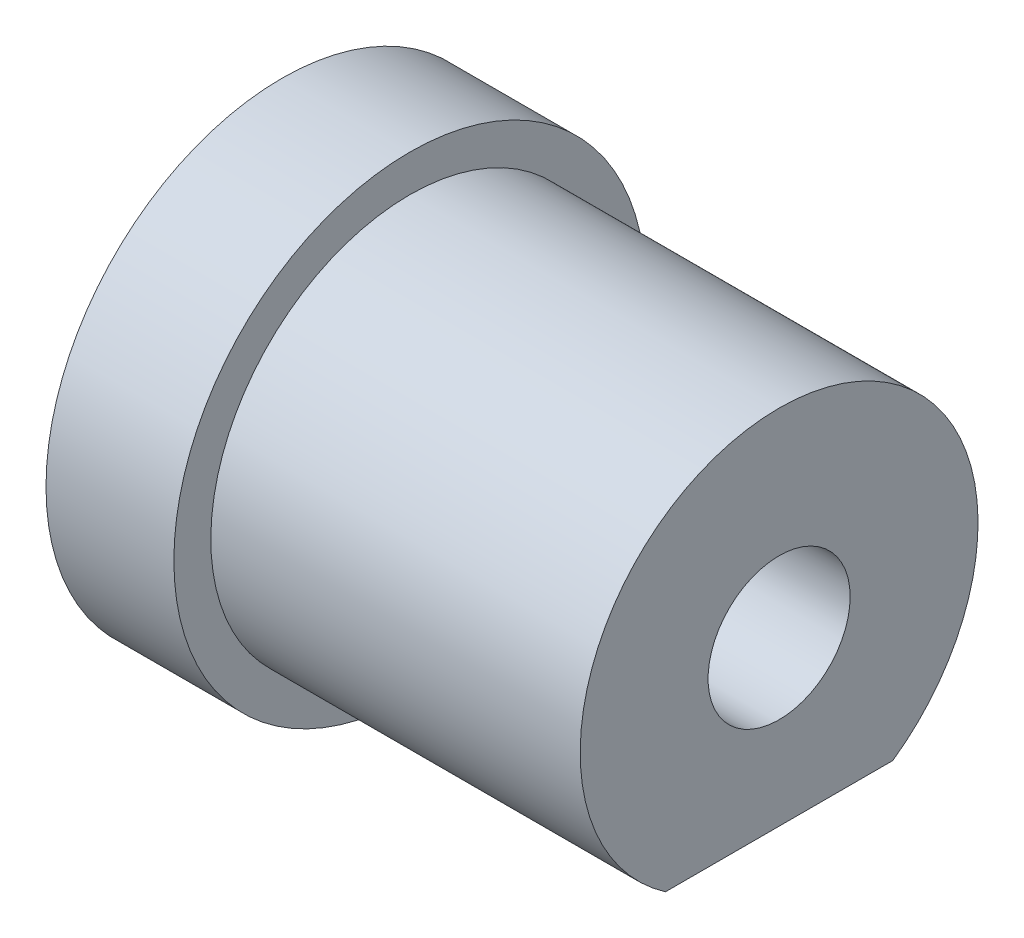
ISO-10303-21;
HEADER;
FILE_DESCRIPTION(('STEP AP214'),'2;1');
FILE_NAME('part.step','',(''),(''),'','','');
FILE_SCHEMA(('AUTOMOTIVE_DESIGN { 1 0 10303 214 1 1 1 1 }'));
ENDSEC;
DATA;
#1=APPLICATION_CONTEXT('core data for automotive mechanical design processes');
#2=APPLICATION_PROTOCOL_DEFINITION('international standard','automotive_design',2000,#1);
#3=PRODUCT_CONTEXT('',#1,'mechanical');
#4=PRODUCT('Part','Part','',(#3));
#5=PRODUCT_RELATED_PRODUCT_CATEGORY('part','',(#4));
#6=PRODUCT_DEFINITION_FORMATION('','',#4);
#7=PRODUCT_DEFINITION_CONTEXT('part definition',#1,'design');
#8=PRODUCT_DEFINITION('design','',#6,#7);
#9=PRODUCT_DEFINITION_SHAPE('','',#8);
#10=(LENGTH_UNIT() NAMED_UNIT(*) SI_UNIT(.MILLI.,.METRE.));
#11=(NAMED_UNIT(*) PLANE_ANGLE_UNIT() SI_UNIT($,.RADIAN.));
#12=(NAMED_UNIT(*) SI_UNIT($,.STERADIAN.) SOLID_ANGLE_UNIT());
#13=UNCERTAINTY_MEASURE_WITH_UNIT(LENGTH_MEASURE(1.E-05),#10,'distance_accuracy_value','');
#14=(GEOMETRIC_REPRESENTATION_CONTEXT(3) GLOBAL_UNCERTAINTY_ASSIGNED_CONTEXT((#13)) GLOBAL_UNIT_ASSIGNED_CONTEXT((#10,
#11,#12)) REPRESENTATION_CONTEXT('',''));
#15=CARTESIAN_POINT('',(0.,0.,0.));
#16=DIRECTION('',(0.,0.,1.));
#17=DIRECTION('',(1.,0.,0.));
#18=AXIS2_PLACEMENT_3D('',#15,#16,#17);
#19=CARTESIAN_POINT('',(0.,0.,0.));
#20=DIRECTION('',(1.,0.,0.));
#21=DIRECTION('',(0.,0.,-1.));
#22=AXIS2_PLACEMENT_3D('',#19,#20,#21);
#23=CYLINDRICAL_SURFACE('',#22,2.5);
#24=CARTESIAN_POINT('',(17.5,0.,0.));
#25=DIRECTION('',(1.,0.,0.));
#26=DIRECTION('',(0.,0.,-1.));
#27=AXIS2_PLACEMENT_3D('',#24,#25,#26);
#28=CIRCLE('',#27,2.5);
#29=CARTESIAN_POINT('',(17.5,0.,-2.5));
#30=VERTEX_POINT('',#29);
#31=EDGE_CURVE('E83',#30,#30,#28,.T.);
#32=ORIENTED_EDGE('',*,*,#31,.T.);
#33=EDGE_LOOP('',(#32));
#34=FACE_BOUND('',#33,.T.);
#35=CARTESIAN_POINT('',(7.,0.,0.));
#36=DIRECTION('',(-1.,0.,0.));
#37=DIRECTION('',(0.,0.,1.));
#38=AXIS2_PLACEMENT_3D('',#35,#36,#37);
#39=CIRCLE('',#38,2.5);
#40=CARTESIAN_POINT('',(7.,0.,2.5));
#41=VERTEX_POINT('',#40);
#42=EDGE_CURVE('E91',#41,#41,#39,.F.);
#43=ORIENTED_EDGE('',*,*,#42,.F.);
#44=EDGE_LOOP('',(#43));
#45=FACE_BOUND('',#44,.T.);
#46=ADVANCED_FACE('F35',(#34,#45),#23,.F.);
#47=CARTESIAN_POINT('',(17.5,0.,0.));
#48=DIRECTION('',(-1.,0.,0.));
#49=DIRECTION('',(0.,0.,1.));
#50=AXIS2_PLACEMENT_3D('',#47,#48,#49);
#51=CYLINDRICAL_SURFACE('',#50,7.);
#52=DIRECTION('',(1.,0.,0.));
#53=VECTOR('',#52,1.);
#54=CARTESIAN_POINT('',(-3.59790855397044,-5.74456264653803,4.));
#55=LINE('',#54,#53);
#56=CARTESIAN_POINT('',(4.5,-5.74456264653803,4.));
#57=VERTEX_POINT('',#56);
#58=CARTESIAN_POINT('',(17.5,-5.74456264653803,4.));
#59=VERTEX_POINT('',#58);
#60=EDGE_CURVE('E66',#57,#59,#55,.T.);
#61=ORIENTED_EDGE('',*,*,#60,.T.);
#62=CARTESIAN_POINT('',(17.5,0.,0.));
#63=DIRECTION('',(1.,0.,0.));
#64=DIRECTION('',(0.,0.,-1.));
#65=AXIS2_PLACEMENT_3D('',#62,#63,#64);
#66=CIRCLE('',#65,7.);
#67=CARTESIAN_POINT('',(17.5,-5.74456264653803,-4.));
#68=VERTEX_POINT('',#67);
#69=EDGE_CURVE('E74',#68,#59,#66,.T.);
#70=ORIENTED_EDGE('',*,*,#69,.F.);
#71=DIRECTION('',(1.,0.,0.));
#72=VECTOR('',#71,1.);
#73=CARTESIAN_POINT('',(-3.59790855397044,-5.74456264653803,-4.));
#74=LINE('',#73,#72);
#75=CARTESIAN_POINT('',(4.5,-5.74456264653803,-4.));
#76=VERTEX_POINT('',#75);
#77=EDGE_CURVE('E52',#76,#68,#74,.T.);
#78=ORIENTED_EDGE('',*,*,#77,.F.);
#79=CARTESIAN_POINT('',(4.5,0.,0.));
#80=DIRECTION('',(1.,0.,0.));
#81=DIRECTION('',(0.,0.,-1.));
#82=AXIS2_PLACEMENT_3D('',#79,#80,#81);
#83=CIRCLE('',#82,7.);
#84=EDGE_CURVE('E75',#76,#57,#83,.T.);
#85=ORIENTED_EDGE('',*,*,#84,.T.);
#86=EDGE_LOOP('',(#61,#70,#78,#85));
#87=FACE_BOUND('',#86,.T.);
#88=ADVANCED_FACE('F73',(#87),#51,.T.);
#89=CARTESIAN_POINT('',(17.5,0.,0.));
#90=DIRECTION('',(1.,0.,0.));
#91=DIRECTION('',(0.,0.,-1.));
#92=AXIS2_PLACEMENT_3D('',#89,#90,#91);
#93=PLANE('',#92);
#94=ORIENTED_EDGE('',*,*,#31,.F.);
#95=EDGE_LOOP('',(#94));
#96=FACE_BOUND('',#95,.T.);
#97=ORIENTED_EDGE('',*,*,#69,.T.);
#98=DIRECTION('',(0.,0.,-1.));
#99=VECTOR('',#98,1.);
#100=CARTESIAN_POINT('',(17.5,-5.74456264653803,4.));
#101=LINE('',#100,#99);
#102=EDGE_CURVE('E63',#59,#68,#101,.T.);
#103=ORIENTED_EDGE('',*,*,#102,.T.);
#104=EDGE_LOOP('',(#97,#103));
#105=FACE_BOUND('',#104,.T.);
#106=ADVANCED_FACE('F77',(#96,#105),#93,.T.);
#107=CARTESIAN_POINT('',(4.5,0.,0.));
#108=DIRECTION('',(1.,0.,0.));
#109=DIRECTION('',(0.,0.,-1.));
#110=AXIS2_PLACEMENT_3D('',#107,#108,#109);
#111=PLANE('',#110);
#112=CARTESIAN_POINT('',(4.5,0.,0.));
#113=DIRECTION('',(1.,0.,0.));
#114=DIRECTION('',(0.,0.,-1.));
#115=AXIS2_PLACEMENT_3D('',#112,#113,#114);
#116=CIRCLE('',#115,8.3);
#117=CARTESIAN_POINT('',(4.5,0.,-8.3));
#118=VERTEX_POINT('',#117);
#119=EDGE_CURVE('E11',#118,#118,#116,.T.);
#120=ORIENTED_EDGE('',*,*,#119,.T.);
#121=EDGE_LOOP('',(#120));
#122=FACE_BOUND('',#121,.T.);
#123=ORIENTED_EDGE('',*,*,#84,.F.);
#124=DIRECTION('',(0.,0.,1.));
#125=VECTOR('',#124,1.);
#126=CARTESIAN_POINT('',(4.5,-5.74456264653803,4.));
#127=LINE('',#126,#125);
#128=EDGE_CURVE('E58',#76,#57,#127,.T.);
#129=ORIENTED_EDGE('',*,*,#128,.T.);
#130=EDGE_LOOP('',(#123,#129));
#131=FACE_BOUND('',#130,.T.);
#132=ADVANCED_FACE('F108',(#122,#131),#111,.T.);
#133=CARTESIAN_POINT('',(4.5,0.,0.));
#134=DIRECTION('',(-1.,0.,0.));
#135=DIRECTION('',(0.,0.,1.));
#136=AXIS2_PLACEMENT_3D('',#133,#134,#135);
#137=CYLINDRICAL_SURFACE('',#136,8.3);
#138=ORIENTED_EDGE('',*,*,#119,.F.);
#139=EDGE_LOOP('',(#138));
#140=FACE_BOUND('',#139,.T.);
#141=CARTESIAN_POINT('',(0.,0.,0.));
#142=DIRECTION('',(1.,0.,0.));
#143=DIRECTION('',(0.,0.,-1.));
#144=AXIS2_PLACEMENT_3D('',#141,#142,#143);
#145=CIRCLE('',#144,8.3);
#146=CARTESIAN_POINT('',(0.,0.,-8.3));
#147=VERTEX_POINT('',#146);
#148=EDGE_CURVE('E44',#147,#147,#145,.T.);
#149=ORIENTED_EDGE('',*,*,#148,.T.);
#150=EDGE_LOOP('',(#149));
#151=FACE_BOUND('',#150,.T.);
#152=ADVANCED_FACE('F37',(#140,#151),#137,.T.);
#153=CARTESIAN_POINT('',(0.,0.,0.));
#154=DIRECTION('',(1.,0.,0.));
#155=DIRECTION('',(0.,0.,-1.));
#156=AXIS2_PLACEMENT_3D('',#153,#154,#155);
#157=PLANE('',#156);
#158=CARTESIAN_POINT('',(0.,0.,-0.216185849922113));
#159=DIRECTION('',(-1.,0.,0.));
#160=DIRECTION('',(0.,0.,1.));
#161=AXIS2_PLACEMENT_3D('',#158,#159,#160);
#162=CIRCLE('',#161,6.1);
#163=CARTESIAN_POINT('',(0.,0.,5.88381415007789));
#164=VERTEX_POINT('',#163);
#165=EDGE_CURVE('E78',#164,#164,#162,.T.);
#166=ORIENTED_EDGE('',*,*,#165,.F.);
#167=EDGE_LOOP('',(#166));
#168=FACE_BOUND('',#167,.T.);
#169=ORIENTED_EDGE('',*,*,#148,.F.);
#170=EDGE_LOOP('',(#169));
#171=FACE_BOUND('',#170,.T.);
#172=ADVANCED_FACE('F180',(#168,#171),#157,.F.);
#173=CARTESIAN_POINT('',(1.4,0.,-0.216185849922113));
#174=DIRECTION('',(-1.,0.,0.));
#175=DIRECTION('',(0.,0.,1.));
#176=AXIS2_PLACEMENT_3D('',#173,#174,#175);
#177=CYLINDRICAL_SURFACE('',#176,6.1);
#178=CARTESIAN_POINT('',(1.4,0.,-0.216185849922113));
#179=DIRECTION('',(-1.,0.,0.));
#180=DIRECTION('',(0.,0.,1.));
#181=AXIS2_PLACEMENT_3D('',#178,#179,#180);
#182=CIRCLE('',#181,6.1);
#183=CARTESIAN_POINT('',(1.4,0.,5.88381415007789));
#184=VERTEX_POINT('',#183);
#185=EDGE_CURVE('E81',#184,#184,#182,.T.);
#186=ORIENTED_EDGE('',*,*,#185,.F.);
#187=EDGE_LOOP('',(#186));
#188=FACE_BOUND('',#187,.T.);
#189=ORIENTED_EDGE('',*,*,#165,.T.);
#190=EDGE_LOOP('',(#189));
#191=FACE_BOUND('',#190,.T.);
#192=ADVANCED_FACE('F175',(#188,#191),#177,.F.);
#193=CARTESIAN_POINT('',(1.4,0.,-0.216185849922113));
#194=DIRECTION('',(-1.,0.,0.));
#195=DIRECTION('',(0.,0.,1.));
#196=AXIS2_PLACEMENT_3D('',#193,#194,#195);
#197=PLANE('',#196);
#198=CARTESIAN_POINT('',(1.4,0.,0.));
#199=DIRECTION('',(-1.,0.,0.));
#200=DIRECTION('',(0.,0.,1.));
#201=AXIS2_PLACEMENT_3D('',#198,#199,#200);
#202=CIRCLE('',#201,3.15);
#203=CARTESIAN_POINT('',(1.4,0.,3.15));
#204=VERTEX_POINT('',#203);
#205=EDGE_CURVE('E39',#204,#204,#202,.T.);
#206=ORIENTED_EDGE('',*,*,#205,.F.);
#207=EDGE_LOOP('',(#206));
#208=FACE_BOUND('',#207,.T.);
#209=ORIENTED_EDGE('',*,*,#185,.T.);
#210=EDGE_LOOP('',(#209));
#211=FACE_BOUND('',#210,.T.);
#212=ADVANCED_FACE('F125',(#208,#211),#197,.T.);
#213=CARTESIAN_POINT('',(-3.59790855397044,-5.74456264653803,4.));
#214=DIRECTION('',(0.,-1.,0.));
#215=DIRECTION('',(0.,0.,-1.));
#216=AXIS2_PLACEMENT_3D('',#213,#214,#215);
#217=PLANE('',#216);
#218=ORIENTED_EDGE('',*,*,#77,.T.);
#219=ORIENTED_EDGE('',*,*,#102,.F.);
#220=ORIENTED_EDGE('',*,*,#60,.F.);
#221=ORIENTED_EDGE('',*,*,#128,.F.);
#222=EDGE_LOOP('',(#218,#219,#220,#221));
#223=FACE_BOUND('',#222,.T.);
#224=ADVANCED_FACE('F65',(#223),#217,.T.);
#225=CARTESIAN_POINT('',(7.,0.,0.));
#226=DIRECTION('',(-1.,0.,0.));
#227=DIRECTION('',(0.,0.,1.));
#228=AXIS2_PLACEMENT_3D('',#225,#226,#227);
#229=PLANE('',#228);
#230=CARTESIAN_POINT('',(7.,0.,0.));
#231=DIRECTION('',(-1.,0.,0.));
#232=DIRECTION('',(0.,0.,1.));
#233=AXIS2_PLACEMENT_3D('',#230,#231,#232);
#234=CIRCLE('',#233,3.15);
#235=CARTESIAN_POINT('',(7.,0.,3.15));
#236=VERTEX_POINT('',#235);
#237=EDGE_CURVE('E93',#236,#236,#234,.T.);
#238=ORIENTED_EDGE('',*,*,#237,.T.);
#239=EDGE_LOOP('',(#238));
#240=FACE_BOUND('',#239,.T.);
#241=ORIENTED_EDGE('',*,*,#42,.T.);
#242=EDGE_LOOP('',(#241));
#243=FACE_BOUND('',#242,.T.);
#244=ADVANCED_FACE('F124',(#240,#243),#229,.T.);
#245=CARTESIAN_POINT('',(7.,0.,0.));
#246=DIRECTION('',(-1.,0.,0.));
#247=DIRECTION('',(0.,0.,1.));
#248=AXIS2_PLACEMENT_3D('',#245,#246,#247);
#249=CYLINDRICAL_SURFACE('',#248,3.15);
#250=ORIENTED_EDGE('',*,*,#205,.T.);
#251=EDGE_LOOP('',(#250));
#252=FACE_BOUND('',#251,.T.);
#253=ORIENTED_EDGE('',*,*,#237,.F.);
#254=EDGE_LOOP('',(#253));
#255=FACE_BOUND('',#254,.T.);
#256=ADVANCED_FACE('F126',(#252,#255),#249,.F.);
#257=CLOSED_SHELL('',(#46,#88,#106,#132,#152,#172,#192,#212,#224,#244,#256));
#258=MANIFOLD_SOLID_BREP('B2',#257);
#259=ADVANCED_BREP_SHAPE_REPRESENTATION('',(#18,#258),#14);
#260=SHAPE_DEFINITION_REPRESENTATION(#9,#259);
ENDSEC;
END-ISO-10303-21;
